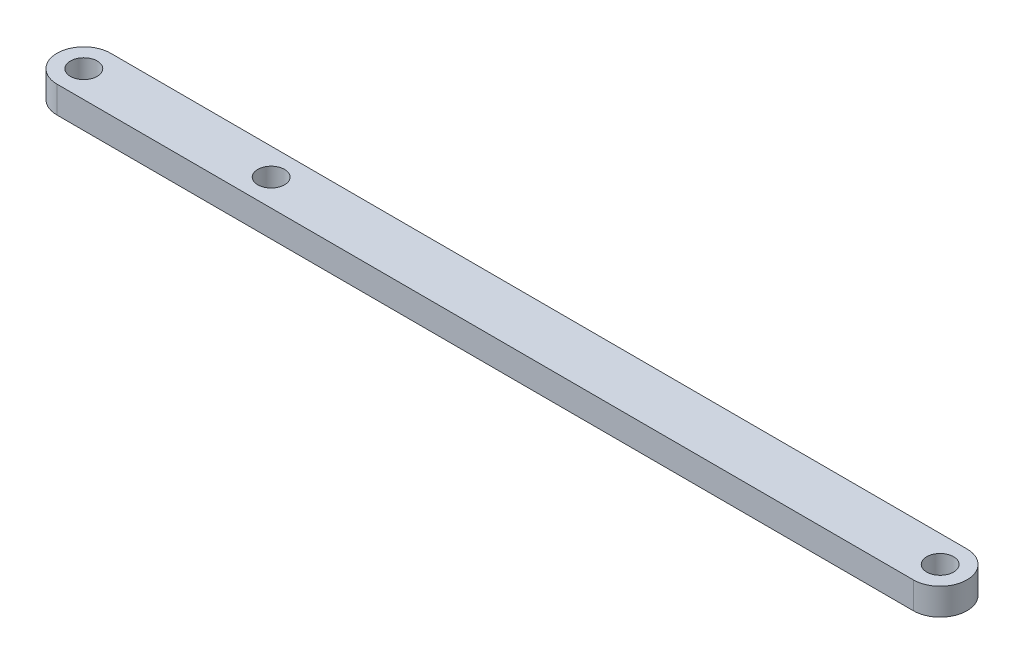
ISO-10303-21;
HEADER;
FILE_DESCRIPTION(('STEP AP214'),'2;1');
FILE_NAME('part.step','',(''),(''),'','','');
FILE_SCHEMA(('AUTOMOTIVE_DESIGN { 1 0 10303 214 1 1 1 1 }'));
ENDSEC;
DATA;
#1=APPLICATION_CONTEXT('core data for automotive mechanical design processes');
#2=APPLICATION_PROTOCOL_DEFINITION('international standard','automotive_design',2000,#1);
#3=PRODUCT_CONTEXT('',#1,'mechanical');
#4=PRODUCT('Part','Part','',(#3));
#5=PRODUCT_RELATED_PRODUCT_CATEGORY('part','',(#4));
#6=PRODUCT_DEFINITION_FORMATION('','',#4);
#7=PRODUCT_DEFINITION_CONTEXT('part definition',#1,'design');
#8=PRODUCT_DEFINITION('design','',#6,#7);
#9=PRODUCT_DEFINITION_SHAPE('','',#8);
#10=(LENGTH_UNIT() NAMED_UNIT(*) SI_UNIT(.MILLI.,.METRE.));
#11=(NAMED_UNIT(*) PLANE_ANGLE_UNIT() SI_UNIT($,.RADIAN.));
#12=(NAMED_UNIT(*) SI_UNIT($,.STERADIAN.) SOLID_ANGLE_UNIT());
#13=UNCERTAINTY_MEASURE_WITH_UNIT(LENGTH_MEASURE(1.E-05),#10,'distance_accuracy_value','');
#14=(GEOMETRIC_REPRESENTATION_CONTEXT(3) GLOBAL_UNCERTAINTY_ASSIGNED_CONTEXT((#13)) GLOBAL_UNIT_ASSIGNED_CONTEXT((#10,
#11,#12)) REPRESENTATION_CONTEXT('',''));
#15=CARTESIAN_POINT('',(0.,0.,0.));
#16=DIRECTION('',(0.,0.,1.));
#17=DIRECTION('',(1.,0.,0.));
#18=AXIS2_PLACEMENT_3D('',#15,#16,#17);
#19=CARTESIAN_POINT('',(-80.6872193121095,5.,3.33952940950526));
#20=DIRECTION('',(0.,-1.,0.));
#21=DIRECTION('',(0.,0.,-1.));
#22=AXIS2_PLACEMENT_3D('',#19,#20,#21);
#23=CYLINDRICAL_SURFACE('',#22,5.);
#24=CARTESIAN_POINT('',(-80.6872193121095,0.,3.33952940950526));
#25=DIRECTION('',(0.,1.,0.));
#26=DIRECTION('',(0.,0.,1.));
#27=AXIS2_PLACEMENT_3D('',#24,#25,#26);
#28=CIRCLE('',#27,5.);
#29=CARTESIAN_POINT('',(-80.6806264908365,0.,-1.66046624396363));
#30=VERTEX_POINT('',#29);
#31=CARTESIAN_POINT('',(-80.6938121333825,0.,8.33952506297413));
#32=VERTEX_POINT('',#31);
#33=EDGE_CURVE('E96',#30,#32,#28,.T.);
#34=ORIENTED_EDGE('',*,*,#33,.T.);
#35=DIRECTION('',(0.,-1.,0.));
#36=VECTOR('',#35,1.);
#37=CARTESIAN_POINT('',(-80.6938121333825,5.,8.33952506297413));
#38=LINE('',#37,#36);
#39=CARTESIAN_POINT('',(-80.6938121333825,5.,8.33952506297413));
#40=VERTEX_POINT('',#39);
#41=EDGE_CURVE('E11',#40,#32,#38,.T.);
#42=ORIENTED_EDGE('',*,*,#41,.F.);
#43=CARTESIAN_POINT('',(-80.6872193121095,5.,3.33952940950526));
#44=DIRECTION('',(0.,1.,0.));
#45=DIRECTION('',(0.,0.,1.));
#46=AXIS2_PLACEMENT_3D('',#43,#44,#45);
#47=CIRCLE('',#46,5.);
#48=CARTESIAN_POINT('',(-80.6806264908365,5.,-1.66046624396363));
#49=VERTEX_POINT('',#48);
#50=EDGE_CURVE('E84',#49,#40,#47,.T.);
#51=ORIENTED_EDGE('',*,*,#50,.F.);
#52=DIRECTION('',(0.,-1.,0.));
#53=VECTOR('',#52,1.);
#54=CARTESIAN_POINT('',(-80.6806264908365,5.,-1.66046624396363));
#55=LINE('',#54,#53);
#56=EDGE_CURVE('E92',#49,#30,#55,.T.);
#57=ORIENTED_EDGE('',*,*,#56,.T.);
#58=EDGE_LOOP('',(#34,#42,#51,#57));
#59=FACE_BOUND('',#58,.T.);
#60=ADVANCED_FACE('F33',(#59),#23,.T.);
#61=CARTESIAN_POINT('',(-80.6938121333825,5.,8.33952506297413));
#62=DIRECTION('',(0.00131856425460673,0.,-0.999999130693775));
#63=DIRECTION('',(-0.999999130693775,0.,-0.00131856425460673));
#64=AXIS2_PLACEMENT_3D('',#61,#62,#63);
#65=PLANE('',#64);
#66=DIRECTION('',(0.999999130693775,0.,0.00131856425460673));
#67=VECTOR('',#66,1.);
#68=CARTESIAN_POINT('',(-80.6938121333825,0.,8.33952506297413));
#69=LINE('',#68,#67);
#70=CARTESIAN_POINT('',(79.3061878666175,0.,8.55049552710915));
#71=VERTEX_POINT('',#70);
#72=EDGE_CURVE('E88',#32,#71,#69,.T.);
#73=ORIENTED_EDGE('',*,*,#72,.T.);
#74=DIRECTION('',(0.,-1.,0.));
#75=VECTOR('',#74,1.);
#76=CARTESIAN_POINT('',(79.3061878666175,5.,8.55049552710915));
#77=LINE('',#76,#75);
#78=CARTESIAN_POINT('',(79.3061878666175,5.,8.55049552710915));
#79=VERTEX_POINT('',#78);
#80=EDGE_CURVE('E41',#79,#71,#77,.T.);
#81=ORIENTED_EDGE('',*,*,#80,.F.);
#82=DIRECTION('',(0.999999130693775,0.,0.00131856425460673));
#83=VECTOR('',#82,1.);
#84=CARTESIAN_POINT('',(-80.6938121333825,5.,8.33952506297413));
#85=LINE('',#84,#83);
#86=EDGE_CURVE('E79',#40,#79,#85,.T.);
#87=ORIENTED_EDGE('',*,*,#86,.F.);
#88=ORIENTED_EDGE('',*,*,#41,.T.);
#89=EDGE_LOOP('',(#73,#81,#87,#88));
#90=FACE_BOUND('',#89,.T.);
#91=ADVANCED_FACE('F87',(#90),#65,.F.);
#92=CARTESIAN_POINT('',(79.3127806878905,5.,3.55049987364027));
#93=DIRECTION('',(0.,-1.,0.));
#94=DIRECTION('',(0.,0.,-1.));
#95=AXIS2_PLACEMENT_3D('',#92,#93,#94);
#96=CYLINDRICAL_SURFACE('',#95,5.);
#97=CARTESIAN_POINT('',(79.3127806878905,0.,3.55049987364027));
#98=DIRECTION('',(0.,1.,0.));
#99=DIRECTION('',(0.,0.,1.));
#100=AXIS2_PLACEMENT_3D('',#97,#98,#99);
#101=CIRCLE('',#100,5.);
#102=CARTESIAN_POINT('',(79.3193735091636,0.,-1.44949577982861));
#103=VERTEX_POINT('',#102);
#104=EDGE_CURVE('E66',#71,#103,#101,.T.);
#105=ORIENTED_EDGE('',*,*,#104,.T.);
#106=DIRECTION('',(0.,-1.,0.));
#107=VECTOR('',#106,1.);
#108=CARTESIAN_POINT('',(79.3193735091636,5.,-1.44949577982861));
#109=LINE('',#108,#107);
#110=CARTESIAN_POINT('',(79.3193735091636,5.,-1.44949577982861));
#111=VERTEX_POINT('',#110);
#112=EDGE_CURVE('E89',#111,#103,#109,.T.);
#113=ORIENTED_EDGE('',*,*,#112,.F.);
#114=CARTESIAN_POINT('',(79.3127806878905,5.,3.55049987364027));
#115=DIRECTION('',(0.,1.,0.));
#116=DIRECTION('',(0.,0.,1.));
#117=AXIS2_PLACEMENT_3D('',#114,#115,#116);
#118=CIRCLE('',#117,5.);
#119=EDGE_CURVE('E82',#79,#111,#118,.T.);
#120=ORIENTED_EDGE('',*,*,#119,.F.);
#121=ORIENTED_EDGE('',*,*,#80,.T.);
#122=EDGE_LOOP('',(#105,#113,#120,#121));
#123=FACE_BOUND('',#122,.T.);
#124=ADVANCED_FACE('F90',(#123),#96,.T.);
#125=CARTESIAN_POINT('',(-80.6806264908365,5.,-1.66046624396363));
#126=DIRECTION('',(-0.00131856425460675,0.,0.999999130693775));
#127=DIRECTION('',(0.999999130693775,0.,0.00131856425460675));
#128=AXIS2_PLACEMENT_3D('',#125,#126,#127);
#129=PLANE('',#128);
#130=DIRECTION('',(-0.999999130693775,0.,-0.00131856425460675));
#131=VECTOR('',#130,1.);
#132=CARTESIAN_POINT('',(-80.6806264908365,0.,-1.66046624396363));
#133=LINE('',#132,#131);
#134=EDGE_CURVE('E72',#103,#30,#133,.T.);
#135=ORIENTED_EDGE('',*,*,#134,.T.);
#136=ORIENTED_EDGE('',*,*,#56,.F.);
#137=DIRECTION('',(-0.999999130693775,0.,-0.00131856425460675));
#138=VECTOR('',#137,1.);
#139=CARTESIAN_POINT('',(-80.6806264908365,5.,-1.66046624396363));
#140=LINE('',#139,#138);
#141=EDGE_CURVE('E49',#111,#49,#140,.T.);
#142=ORIENTED_EDGE('',*,*,#141,.F.);
#143=ORIENTED_EDGE('',*,*,#112,.T.);
#144=EDGE_LOOP('',(#135,#136,#142,#143));
#145=FACE_BOUND('',#144,.T.);
#146=ADVANCED_FACE('F104',(#145),#129,.F.);
#147=CARTESIAN_POINT('',(-80.6872193121095,5.,3.33952940950526));
#148=DIRECTION('',(0.,1.,0.));
#149=DIRECTION('',(0.,0.,1.));
#150=AXIS2_PLACEMENT_3D('',#147,#148,#149);
#151=PLANE('',#150);
#152=CARTESIAN_POINT('',(-80.6872193121095,5.,3.33952940950525));
#153=DIRECTION('',(0.,1.,0.));
#154=DIRECTION('',(0.,0.,1.));
#155=AXIS2_PLACEMENT_3D('',#152,#153,#154);
#156=CIRCLE('',#155,2.5);
#157=CARTESIAN_POINT('',(-80.6872193121095,5.,5.83952940950525));
#158=VERTEX_POINT('',#157);
#159=EDGE_CURVE('E120',#158,#158,#156,.T.);
#160=ORIENTED_EDGE('',*,*,#159,.F.);
#161=EDGE_LOOP('',(#160));
#162=FACE_BOUND('',#161,.T.);
#163=CARTESIAN_POINT('',(79.3127806878905,5.,3.55049987364027));
#164=DIRECTION('',(0.,1.,0.));
#165=DIRECTION('',(0.,0.,1.));
#166=AXIS2_PLACEMENT_3D('',#163,#164,#165);
#167=CIRCLE('',#166,2.49999999999999);
#168=CARTESIAN_POINT('',(79.3127806878905,5.,6.05049987364026));
#169=VERTEX_POINT('',#168);
#170=EDGE_CURVE('E113',#169,#169,#167,.T.);
#171=ORIENTED_EDGE('',*,*,#170,.F.);
#172=EDGE_LOOP('',(#171));
#173=FACE_BOUND('',#172,.T.);
#174=CARTESIAN_POINT('',(-45.6872497378273,5.,3.38567915841649));
#175=DIRECTION('',(0.,1.,0.));
#176=DIRECTION('',(0.,0.,1.));
#177=AXIS2_PLACEMENT_3D('',#174,#175,#176);
#178=CIRCLE('',#177,2.5);
#179=CARTESIAN_POINT('',(-45.6872497378273,5.,5.88567915841649));
#180=VERTEX_POINT('',#179);
#181=EDGE_CURVE('E114',#180,#180,#178,.T.);
#182=ORIENTED_EDGE('',*,*,#181,.F.);
#183=EDGE_LOOP('',(#182));
#184=FACE_BOUND('',#183,.T.);
#185=ORIENTED_EDGE('',*,*,#50,.T.);
#186=ORIENTED_EDGE('',*,*,#86,.T.);
#187=ORIENTED_EDGE('',*,*,#119,.T.);
#188=ORIENTED_EDGE('',*,*,#141,.T.);
#189=EDGE_LOOP('',(#185,#186,#187,#188));
#190=FACE_BOUND('',#189,.T.);
#191=ADVANCED_FACE('F80',(#162,#173,#184,#190),#151,.T.);
#192=CARTESIAN_POINT('',(-80.6872193121095,0.,3.33952940950526));
#193=DIRECTION('',(0.,1.,0.));
#194=DIRECTION('',(0.,0.,1.));
#195=AXIS2_PLACEMENT_3D('',#192,#193,#194);
#196=PLANE('',#195);
#197=CARTESIAN_POINT('',(-80.6872193121095,0.,3.33952940950525));
#198=DIRECTION('',(0.,1.,0.));
#199=DIRECTION('',(0.,0.,1.));
#200=AXIS2_PLACEMENT_3D('',#197,#198,#199);
#201=CIRCLE('',#200,2.5);
#202=CARTESIAN_POINT('',(-80.6872193121095,0.,5.83952940950525));
#203=VERTEX_POINT('',#202);
#204=EDGE_CURVE('E99',#203,#203,#201,.F.);
#205=ORIENTED_EDGE('',*,*,#204,.F.);
#206=EDGE_LOOP('',(#205));
#207=FACE_BOUND('',#206,.T.);
#208=CARTESIAN_POINT('',(79.3127806878905,0.,3.55049987364027));
#209=DIRECTION('',(0.,1.,0.));
#210=DIRECTION('',(0.,0.,1.));
#211=AXIS2_PLACEMENT_3D('',#208,#209,#210);
#212=CIRCLE('',#211,2.49999999999999);
#213=CARTESIAN_POINT('',(79.3127806878905,0.,6.05049987364026));
#214=VERTEX_POINT('',#213);
#215=EDGE_CURVE('E117',#214,#214,#212,.F.);
#216=ORIENTED_EDGE('',*,*,#215,.F.);
#217=EDGE_LOOP('',(#216));
#218=FACE_BOUND('',#217,.T.);
#219=CARTESIAN_POINT('',(-45.6872497378273,0.,3.38567915841649));
#220=DIRECTION('',(0.,1.,0.));
#221=DIRECTION('',(0.,0.,1.));
#222=AXIS2_PLACEMENT_3D('',#219,#220,#221);
#223=CIRCLE('',#222,2.5);
#224=CARTESIAN_POINT('',(-45.6872497378273,0.,5.88567915841649));
#225=VERTEX_POINT('',#224);
#226=EDGE_CURVE('E110',#225,#225,#223,.F.);
#227=ORIENTED_EDGE('',*,*,#226,.F.);
#228=EDGE_LOOP('',(#227));
#229=FACE_BOUND('',#228,.T.);
#230=ORIENTED_EDGE('',*,*,#33,.F.);
#231=ORIENTED_EDGE('',*,*,#134,.F.);
#232=ORIENTED_EDGE('',*,*,#104,.F.);
#233=ORIENTED_EDGE('',*,*,#72,.F.);
#234=EDGE_LOOP('',(#230,#231,#232,#233));
#235=FACE_BOUND('',#234,.T.);
#236=ADVANCED_FACE('F107',(#207,#218,#229,#235),#196,.F.);
#237=CARTESIAN_POINT('',(-45.6872497378273,-0.00100000000000013,3.38567915841649));
#238=DIRECTION('',(0.,1.,0.));
#239=DIRECTION('',(0.,0.,1.));
#240=AXIS2_PLACEMENT_3D('',#237,#238,#239);
#241=CYLINDRICAL_SURFACE('',#240,2.5);
#242=ORIENTED_EDGE('',*,*,#181,.T.);
#243=EDGE_LOOP('',(#242));
#244=FACE_BOUND('',#243,.T.);
#245=ORIENTED_EDGE('',*,*,#226,.T.);
#246=EDGE_LOOP('',(#245));
#247=FACE_BOUND('',#246,.T.);
#248=ADVANCED_FACE('F138',(#244,#247),#241,.F.);
#249=CARTESIAN_POINT('',(79.3127806878905,-0.00100000000000013,3.55049987364027));
#250=DIRECTION('',(0.,1.,0.));
#251=DIRECTION('',(0.,0.,1.));
#252=AXIS2_PLACEMENT_3D('',#249,#250,#251);
#253=CYLINDRICAL_SURFACE('',#252,2.49999999999999);
#254=ORIENTED_EDGE('',*,*,#170,.T.);
#255=EDGE_LOOP('',(#254));
#256=FACE_BOUND('',#255,.T.);
#257=ORIENTED_EDGE('',*,*,#215,.T.);
#258=EDGE_LOOP('',(#257));
#259=FACE_BOUND('',#258,.T.);
#260=ADVANCED_FACE('F141',(#256,#259),#253,.F.);
#261=CARTESIAN_POINT('',(-80.6872193121095,-0.00100000000000013,3.33952940950525));
#262=DIRECTION('',(0.,1.,0.));
#263=DIRECTION('',(0.,0.,1.));
#264=AXIS2_PLACEMENT_3D('',#261,#262,#263);
#265=CYLINDRICAL_SURFACE('',#264,2.5);
#266=ORIENTED_EDGE('',*,*,#159,.T.);
#267=EDGE_LOOP('',(#266));
#268=FACE_BOUND('',#267,.T.);
#269=ORIENTED_EDGE('',*,*,#204,.T.);
#270=EDGE_LOOP('',(#269));
#271=FACE_BOUND('',#270,.T.);
#272=ADVANCED_FACE('F128',(#268,#271),#265,.F.);
#273=CLOSED_SHELL('',(#60,#91,#124,#146,#191,#236,#248,#260,#272));
#274=MANIFOLD_SOLID_BREP('B2',#273);
#275=ADVANCED_BREP_SHAPE_REPRESENTATION('',(#18,#274),#14);
#276=SHAPE_DEFINITION_REPRESENTATION(#9,#275);
ENDSEC;
END-ISO-10303-21;
